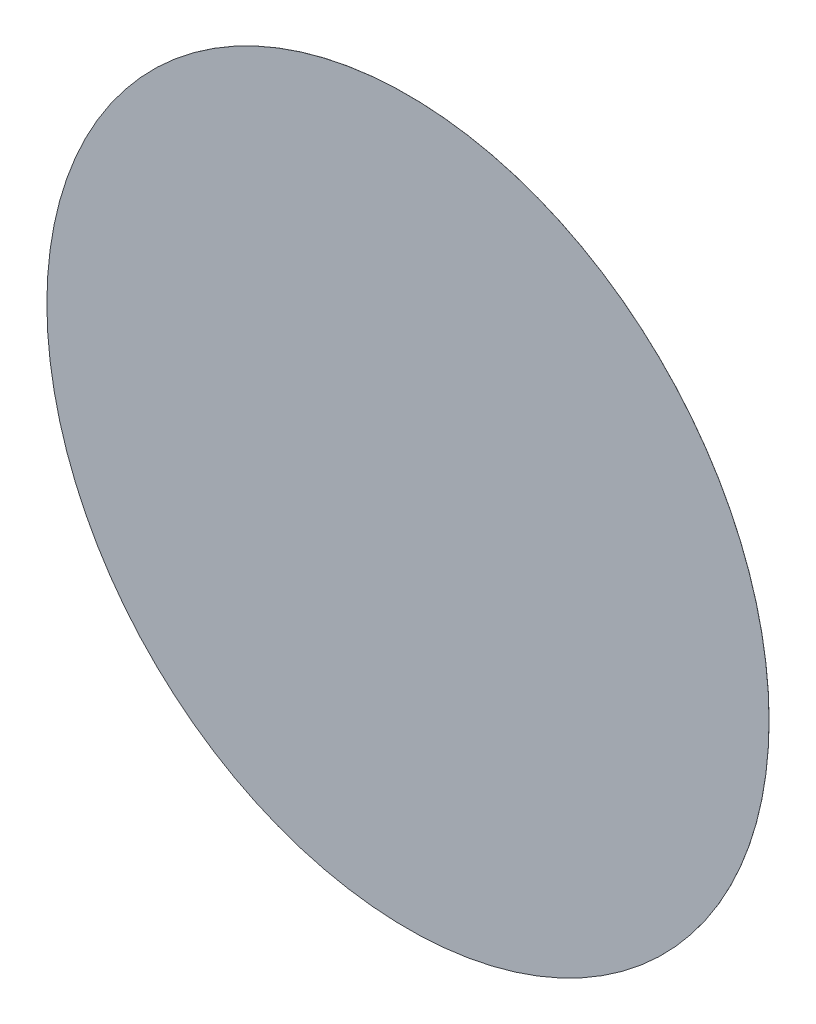
ISO-10303-21;
HEADER;
FILE_DESCRIPTION(('STEP AP214'),'2;1');
FILE_NAME('part.step','',(''),(''),'','','');
FILE_SCHEMA(('AUTOMOTIVE_DESIGN { 1 0 10303 214 1 1 1 1 }'));
ENDSEC;
DATA;
#1=APPLICATION_CONTEXT('core data for automotive mechanical design processes');
#2=APPLICATION_PROTOCOL_DEFINITION('international standard','automotive_design',2000,#1);
#3=PRODUCT_CONTEXT('',#1,'mechanical');
#4=PRODUCT('Part','Part','',(#3));
#5=PRODUCT_RELATED_PRODUCT_CATEGORY('part','',(#4));
#6=PRODUCT_DEFINITION_FORMATION('','',#4);
#7=PRODUCT_DEFINITION_CONTEXT('part definition',#1,'design');
#8=PRODUCT_DEFINITION('design','',#6,#7);
#9=PRODUCT_DEFINITION_SHAPE('','',#8);
#10=(LENGTH_UNIT() NAMED_UNIT(*) SI_UNIT(.MILLI.,.METRE.));
#11=(NAMED_UNIT(*) PLANE_ANGLE_UNIT() SI_UNIT($,.RADIAN.));
#12=(NAMED_UNIT(*) SI_UNIT($,.STERADIAN.) SOLID_ANGLE_UNIT());
#13=UNCERTAINTY_MEASURE_WITH_UNIT(LENGTH_MEASURE(1.E-05),#10,'distance_accuracy_value','');
#14=(GEOMETRIC_REPRESENTATION_CONTEXT(3) GLOBAL_UNCERTAINTY_ASSIGNED_CONTEXT((#13)) GLOBAL_UNIT_ASSIGNED_CONTEXT((#10,
#11,#12)) REPRESENTATION_CONTEXT('',''));
#15=CARTESIAN_POINT('',(0.,0.,0.));
#16=DIRECTION('',(0.,0.,1.));
#17=DIRECTION('',(1.,0.,0.));
#18=AXIS2_PLACEMENT_3D('',#15,#16,#17);
#19=CARTESIAN_POINT('',(-205.267479393102,78.6103218486938,0.15));
#20=DIRECTION('',(0.,0.,-1.));
#21=DIRECTION('',(-1.,0.,0.));
#22=AXIS2_PLACEMENT_3D('',#19,#20,#21);
#23=CYLINDRICAL_SURFACE('',#22,818.837232426493);
#24=CARTESIAN_POINT('',(-205.267479393102,78.6103218486938,0.15));
#25=DIRECTION('',(0.,0.,1.));
#26=DIRECTION('',(1.,0.,0.));
#27=AXIS2_PLACEMENT_3D('',#24,#25,#26);
#28=CIRCLE('',#27,818.837232426493);
#29=CARTESIAN_POINT('',(613.56975303339,78.6103218486938,0.15));
#30=VERTEX_POINT('',#29);
#31=EDGE_CURVE('E10',#30,#30,#28,.T.);
#32=ORIENTED_EDGE('',*,*,#31,.F.);
#33=EDGE_LOOP('',(#32));
#34=FACE_BOUND('',#33,.T.);
#35=CARTESIAN_POINT('',(-205.267479393102,78.6103218486938,0.));
#36=DIRECTION('',(0.,0.,1.));
#37=DIRECTION('',(1.,0.,0.));
#38=AXIS2_PLACEMENT_3D('',#35,#36,#37);
#39=CIRCLE('',#38,818.837232426493);
#40=CARTESIAN_POINT('',(613.56975303339,78.6103218486938,0.));
#41=VERTEX_POINT('',#40);
#42=EDGE_CURVE('E36',#41,#41,#39,.T.);
#43=ORIENTED_EDGE('',*,*,#42,.T.);
#44=EDGE_LOOP('',(#43));
#45=FACE_BOUND('',#44,.T.);
#46=ADVANCED_FACE('F33',(#34,#45),#23,.T.);
#47=CARTESIAN_POINT('',(-205.267479393102,78.6103218486938,0.15));
#48=DIRECTION('',(0.,0.,1.));
#49=DIRECTION('',(1.,0.,0.));
#50=AXIS2_PLACEMENT_3D('',#47,#48,#49);
#51=PLANE('',#50);
#52=ORIENTED_EDGE('',*,*,#31,.T.);
#53=EDGE_LOOP('',(#52));
#54=FACE_BOUND('',#53,.T.);
#55=ADVANCED_FACE('F48',(#54),#51,.T.);
#56=CARTESIAN_POINT('',(-205.267479393102,78.6103218486938,0.));
#57=DIRECTION('',(0.,0.,1.));
#58=DIRECTION('',(1.,0.,0.));
#59=AXIS2_PLACEMENT_3D('',#56,#57,#58);
#60=PLANE('',#59);
#61=ORIENTED_EDGE('',*,*,#42,.F.);
#62=EDGE_LOOP('',(#61));
#63=FACE_BOUND('',#62,.T.);
#64=ADVANCED_FACE('F46',(#63),#60,.F.);
#65=CLOSED_SHELL('',(#46,#55,#64));
#66=MANIFOLD_SOLID_BREP('B2',#65);
#67=ADVANCED_BREP_SHAPE_REPRESENTATION('',(#18,#66),#14);
#68=SHAPE_DEFINITION_REPRESENTATION(#9,#67);
ENDSEC;
END-ISO-10303-21;
